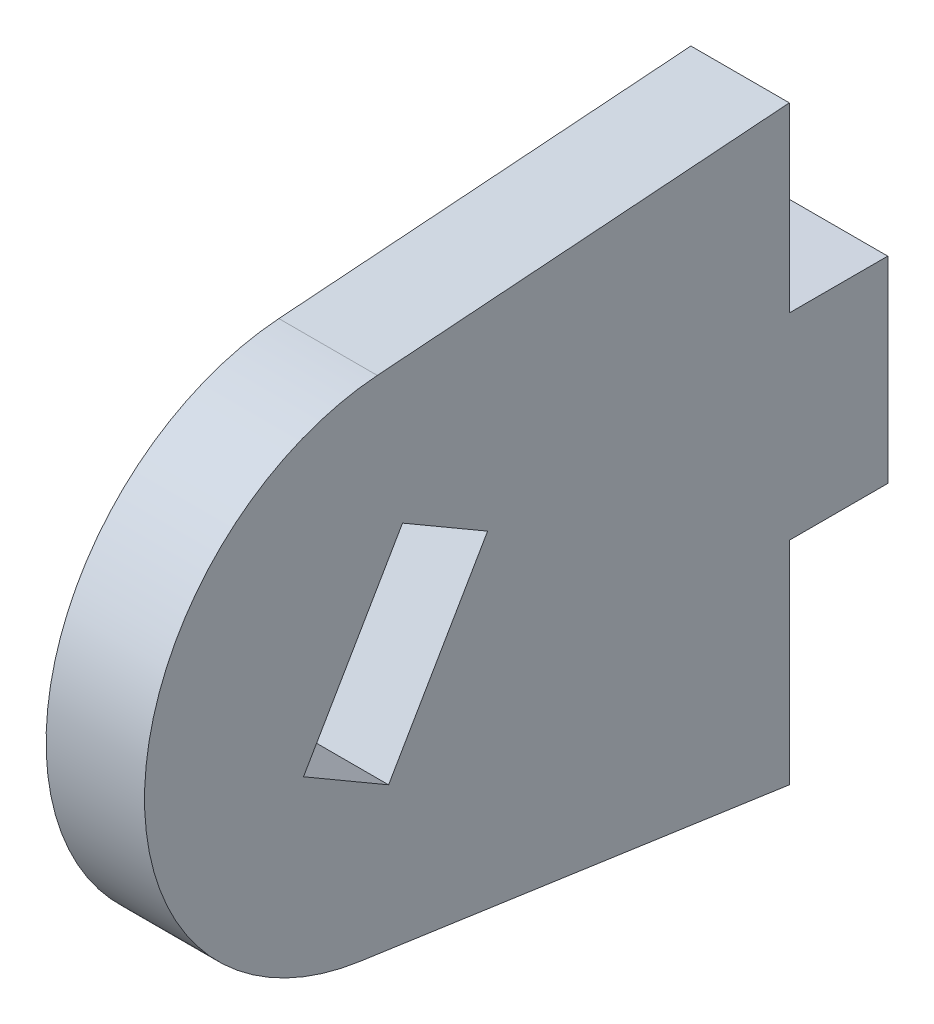
ISO-10303-21;
HEADER;
FILE_DESCRIPTION(('STEP AP214'),'2;1');
FILE_NAME('part.step','',(''),(''),'','','');
FILE_SCHEMA(('AUTOMOTIVE_DESIGN { 1 0 10303 214 1 1 1 1 }'));
ENDSEC;
DATA;
#1=APPLICATION_CONTEXT('core data for automotive mechanical design processes');
#2=APPLICATION_PROTOCOL_DEFINITION('international standard','automotive_design',2000,#1);
#3=PRODUCT_CONTEXT('',#1,'mechanical');
#4=PRODUCT('Part','Part','',(#3));
#5=PRODUCT_RELATED_PRODUCT_CATEGORY('part','',(#4));
#6=PRODUCT_DEFINITION_FORMATION('','',#4);
#7=PRODUCT_DEFINITION_CONTEXT('part definition',#1,'design');
#8=PRODUCT_DEFINITION('design','',#6,#7);
#9=PRODUCT_DEFINITION_SHAPE('','',#8);
#10=(LENGTH_UNIT() NAMED_UNIT(*) SI_UNIT(.MILLI.,.METRE.));
#11=(NAMED_UNIT(*) PLANE_ANGLE_UNIT() SI_UNIT($,.RADIAN.));
#12=(NAMED_UNIT(*) SI_UNIT($,.STERADIAN.) SOLID_ANGLE_UNIT());
#13=UNCERTAINTY_MEASURE_WITH_UNIT(LENGTH_MEASURE(1.E-05),#10,'distance_accuracy_value','');
#14=(GEOMETRIC_REPRESENTATION_CONTEXT(3) GLOBAL_UNCERTAINTY_ASSIGNED_CONTEXT((#13)) GLOBAL_UNIT_ASSIGNED_CONTEXT((#10,
#11,#12)) REPRESENTATION_CONTEXT('',''));
#15=CARTESIAN_POINT('',(0.,0.,0.));
#16=DIRECTION('',(0.,0.,1.));
#17=DIRECTION('',(1.,0.,0.));
#18=AXIS2_PLACEMENT_3D('',#15,#16,#17);
#19=CARTESIAN_POINT('',(2.5,0.,20.));
#20=DIRECTION('',(1.,0.,0.));
#21=DIRECTION('',(0.,0.,-1.));
#22=AXIS2_PLACEMENT_3D('',#19,#20,#21);
#23=PLANE('',#22);
#24=DIRECTION('',(0.,1.,0.));
#25=VECTOR('',#24,1.);
#26=CARTESIAN_POINT('',(2.5,5.,0.));
#27=LINE('',#26,#25);
#28=CARTESIAN_POINT('',(2.5,5.,0.));
#29=VERTEX_POINT('',#28);
#30=CARTESIAN_POINT('',(2.5,14.2422824883128,0.));
#31=VERTEX_POINT('',#30);
#32=EDGE_CURVE('E164',#29,#31,#27,.T.);
#33=ORIENTED_EDGE('',*,*,#32,.T.);
#34=DIRECTION('',(0.,-0.0727282972971378,0.997351790880359));
#35=VECTOR('',#34,1.);
#36=CARTESIAN_POINT('',(2.5,14.2422824883128,0.));
#37=LINE('',#36,#35);
#38=CARTESIAN_POINT('',(2.5,12.7162353337246,20.9272857905385));
#39=VERTEX_POINT('',#38);
#40=EDGE_CURVE('E167',#31,#39,#37,.T.);
#41=ORIENTED_EDGE('',*,*,#40,.T.);
#42=CARTESIAN_POINT('',(2.5,0.,20.));
#43=DIRECTION('',(1.,0.,0.));
#44=DIRECTION('',(0.,0.,-1.));
#45=AXIS2_PLACEMENT_3D('',#42,#43,#44);
#46=CIRCLE('',#45,12.75);
#47=CARTESIAN_POINT('',(2.5,-12.6201385773802,21.8151039330352));
#48=VERTEX_POINT('',#47);
#49=EDGE_CURVE('E170',#39,#48,#46,.T.);
#50=ORIENTED_EDGE('',*,*,#49,.T.);
#51=DIRECTION('',(0.,-0.142361092787071,-0.989814790382762));
#52=VECTOR('',#51,1.);
#53=CARTESIAN_POINT('',(2.5,-15.7577175116872,0.));
#54=LINE('',#53,#52);
#55=CARTESIAN_POINT('',(2.5,-15.7577175116872,0.));
#56=VERTEX_POINT('',#55);
#57=EDGE_CURVE('E172',#48,#56,#54,.T.);
#58=ORIENTED_EDGE('',*,*,#57,.T.);
#59=DIRECTION('',(0.,1.,0.));
#60=VECTOR('',#59,1.);
#61=CARTESIAN_POINT('',(2.5,-15.7577175116872,0.));
#62=LINE('',#61,#60);
#63=CARTESIAN_POINT('',(2.5,-5.,0.));
#64=VERTEX_POINT('',#63);
#65=EDGE_CURVE('E174',#56,#64,#62,.T.);
#66=ORIENTED_EDGE('',*,*,#65,.T.);
#67=DIRECTION('',(0.,0.,-1.));
#68=VECTOR('',#67,1.);
#69=CARTESIAN_POINT('',(2.5,-5.,-5.));
#70=LINE('',#69,#68);
#71=CARTESIAN_POINT('',(2.5,-5.,-5.));
#72=VERTEX_POINT('',#71);
#73=EDGE_CURVE('E176',#64,#72,#70,.T.);
#74=ORIENTED_EDGE('',*,*,#73,.T.);
#75=DIRECTION('',(0.,1.,0.));
#76=VECTOR('',#75,1.);
#77=CARTESIAN_POINT('',(2.5,5.,-5.));
#78=LINE('',#77,#76);
#79=CARTESIAN_POINT('',(2.5,5.,-5.));
#80=VERTEX_POINT('',#79);
#81=EDGE_CURVE('E178',#72,#80,#78,.T.);
#82=ORIENTED_EDGE('',*,*,#81,.T.);
#83=DIRECTION('',(0.,0.,1.));
#84=VECTOR('',#83,1.);
#85=CARTESIAN_POINT('',(2.5,5.,-5.));
#86=LINE('',#85,#84);
#87=EDGE_CURVE('E180',#80,#29,#86,.T.);
#88=ORIENTED_EDGE('',*,*,#87,.T.);
#89=EDGE_LOOP('',(#33,#41,#50,#58,#66,#74,#82,#88));
#90=FACE_BOUND('',#89,.T.);
#91=DIRECTION('',(0.,0.864310534046553,-0.502958547731483));
#92=VECTOR('',#91,1.);
#93=CARTESIAN_POINT('',(2.5,-5.57894903956147,20.3540164035411));
#94=LINE('',#93,#92);
#95=CARTESIAN_POINT('',(2.5,-5.57894903956147,20.3540164035411));
#96=VERTEX_POINT('',#95);
#97=CARTESIAN_POINT('',(2.5,3.06415630090407,15.3244309262262));
#98=VERTEX_POINT('',#97);
#99=EDGE_CURVE('E136',#96,#98,#94,.T.);
#100=ORIENTED_EDGE('',*,*,#99,.F.);
#101=DIRECTION('',(0.,-0.502958547731484,-0.864310534046552));
#102=VECTOR('',#101,1.);
#103=CARTESIAN_POINT('',(2.5,-3.06415630090405,24.6755690737738));
#104=LINE('',#103,#102);
#105=CARTESIAN_POINT('',(2.5,-3.06415630090405,24.6755690737738));
#106=VERTEX_POINT('',#105);
#107=EDGE_CURVE('E128',#106,#96,#104,.T.);
#108=ORIENTED_EDGE('',*,*,#107,.F.);
#109=DIRECTION('',(0.,-0.864310534046553,0.502958547731483));
#110=VECTOR('',#109,1.);
#111=CARTESIAN_POINT('',(2.5,5.57894903956148,19.645983596459));
#112=LINE('',#111,#110);
#113=CARTESIAN_POINT('',(2.5,5.57894903956148,19.645983596459));
#114=VERTEX_POINT('',#113);
#115=EDGE_CURVE('E150',#114,#106,#112,.T.);
#116=ORIENTED_EDGE('',*,*,#115,.F.);
#117=DIRECTION('',(0.,0.502958547731482,0.864310534046553));
#118=VECTOR('',#117,1.);
#119=CARTESIAN_POINT('',(2.5,3.06415630090407,15.3244309262262));
#120=LINE('',#119,#118);
#121=EDGE_CURVE('E148',#98,#114,#120,.T.);
#122=ORIENTED_EDGE('',*,*,#121,.F.);
#123=EDGE_LOOP('',(#100,#108,#116,#122));
#124=FACE_BOUND('',#123,.T.);
#125=ADVANCED_FACE('F39',(#90,#124),#23,.T.);
#126=CARTESIAN_POINT('',(-2.5,0.,20.));
#127=DIRECTION('',(1.,0.,0.));
#128=DIRECTION('',(0.,0.,-1.));
#129=AXIS2_PLACEMENT_3D('',#126,#127,#128);
#130=PLANE('',#129);
#131=DIRECTION('',(0.,1.,0.));
#132=VECTOR('',#131,1.);
#133=CARTESIAN_POINT('',(-2.5,5.,0.));
#134=LINE('',#133,#132);
#135=CARTESIAN_POINT('',(-2.5,5.,0.));
#136=VERTEX_POINT('',#135);
#137=CARTESIAN_POINT('',(-2.5,14.2422824883128,0.));
#138=VERTEX_POINT('',#137);
#139=EDGE_CURVE('E144',#136,#138,#134,.T.);
#140=ORIENTED_EDGE('',*,*,#139,.F.);
#141=DIRECTION('',(0.,0.,1.));
#142=VECTOR('',#141,1.);
#143=CARTESIAN_POINT('',(-2.5,5.,-5.));
#144=LINE('',#143,#142);
#145=CARTESIAN_POINT('',(-2.5,5.,-5.));
#146=VERTEX_POINT('',#145);
#147=EDGE_CURVE('E168',#146,#136,#144,.T.);
#148=ORIENTED_EDGE('',*,*,#147,.F.);
#149=DIRECTION('',(0.,1.,0.));
#150=VECTOR('',#149,1.);
#151=CARTESIAN_POINT('',(-2.5,5.,-5.));
#152=LINE('',#151,#150);
#153=CARTESIAN_POINT('',(-2.5,-5.,-5.));
#154=VERTEX_POINT('',#153);
#155=EDGE_CURVE('E195',#154,#146,#152,.T.);
#156=ORIENTED_EDGE('',*,*,#155,.F.);
#157=DIRECTION('',(0.,0.,-1.));
#158=VECTOR('',#157,1.);
#159=CARTESIAN_POINT('',(-2.5,-5.,-5.));
#160=LINE('',#159,#158);
#161=CARTESIAN_POINT('',(-2.5,-5.,0.));
#162=VERTEX_POINT('',#161);
#163=EDGE_CURVE('E193',#162,#154,#160,.T.);
#164=ORIENTED_EDGE('',*,*,#163,.F.);
#165=DIRECTION('',(0.,1.,0.));
#166=VECTOR('',#165,1.);
#167=CARTESIAN_POINT('',(-2.5,-15.7577175116872,0.));
#168=LINE('',#167,#166);
#169=CARTESIAN_POINT('',(-2.5,-15.7577175116872,0.));
#170=VERTEX_POINT('',#169);
#171=EDGE_CURVE('E191',#170,#162,#168,.T.);
#172=ORIENTED_EDGE('',*,*,#171,.F.);
#173=DIRECTION('',(0.,-0.142361092787071,-0.989814790382762));
#174=VECTOR('',#173,1.);
#175=CARTESIAN_POINT('',(-2.5,-15.7577175116872,0.));
#176=LINE('',#175,#174);
#177=CARTESIAN_POINT('',(-2.5,-12.6201385773802,21.8151039330352));
#178=VERTEX_POINT('',#177);
#179=EDGE_CURVE('E189',#178,#170,#176,.T.);
#180=ORIENTED_EDGE('',*,*,#179,.F.);
#181=CARTESIAN_POINT('',(-2.5,0.,20.));
#182=DIRECTION('',(1.,0.,0.));
#183=DIRECTION('',(0.,0.,-1.));
#184=AXIS2_PLACEMENT_3D('',#181,#182,#183);
#185=CIRCLE('',#184,12.75);
#186=CARTESIAN_POINT('',(-2.5,12.7162353337246,20.9272857905385));
#187=VERTEX_POINT('',#186);
#188=EDGE_CURVE('E187',#187,#178,#185,.T.);
#189=ORIENTED_EDGE('',*,*,#188,.F.);
#190=DIRECTION('',(0.,-0.0727282972971378,0.997351790880359));
#191=VECTOR('',#190,1.);
#192=CARTESIAN_POINT('',(-2.5,14.2422824883128,0.));
#193=LINE('',#192,#191);
#194=EDGE_CURVE('E185',#138,#187,#193,.T.);
#195=ORIENTED_EDGE('',*,*,#194,.F.);
#196=EDGE_LOOP('',(#140,#148,#156,#164,#172,#180,#189,#195));
#197=FACE_BOUND('',#196,.T.);
#198=DIRECTION('',(0.,-0.502958547731484,-0.864310534046552));
#199=VECTOR('',#198,1.);
#200=CARTESIAN_POINT('',(-2.5,-3.06415630090405,24.6755690737738));
#201=LINE('',#200,#199);
#202=CARTESIAN_POINT('',(-2.5,-3.06415630090405,24.6755690737738));
#203=VERTEX_POINT('',#202);
#204=CARTESIAN_POINT('',(-2.5,-5.57894903956147,20.3540164035411));
#205=VERTEX_POINT('',#204);
#206=EDGE_CURVE('E62',#203,#205,#201,.T.);
#207=ORIENTED_EDGE('',*,*,#206,.T.);
#208=DIRECTION('',(0.,0.864310534046553,-0.502958547731483));
#209=VECTOR('',#208,1.);
#210=CARTESIAN_POINT('',(-2.5,-5.57894903956147,20.3540164035411));
#211=LINE('',#210,#209);
#212=CARTESIAN_POINT('',(-2.5,3.06415630090407,15.3244309262262));
#213=VERTEX_POINT('',#212);
#214=EDGE_CURVE('E143',#205,#213,#211,.T.);
#215=ORIENTED_EDGE('',*,*,#214,.T.);
#216=DIRECTION('',(0.,0.502958547731482,0.864310534046553));
#217=VECTOR('',#216,1.);
#218=CARTESIAN_POINT('',(-2.5,3.06415630090407,15.3244309262262));
#219=LINE('',#218,#217);
#220=CARTESIAN_POINT('',(-2.5,5.57894903956148,19.645983596459));
#221=VERTEX_POINT('',#220);
#222=EDGE_CURVE('E156',#213,#221,#219,.T.);
#223=ORIENTED_EDGE('',*,*,#222,.T.);
#224=DIRECTION('',(0.,-0.864310534046553,0.502958547731483));
#225=VECTOR('',#224,1.);
#226=CARTESIAN_POINT('',(-2.5,5.57894903956148,19.645983596459));
#227=LINE('',#226,#225);
#228=EDGE_CURVE('E137',#221,#203,#227,.T.);
#229=ORIENTED_EDGE('',*,*,#228,.T.);
#230=EDGE_LOOP('',(#207,#215,#223,#229));
#231=FACE_BOUND('',#230,.T.);
#232=ADVANCED_FACE('F225',(#197,#231),#130,.F.);
#233=CARTESIAN_POINT('',(2.5,5.,0.));
#234=DIRECTION('',(0.,0.,1.));
#235=DIRECTION('',(1.,0.,0.));
#236=AXIS2_PLACEMENT_3D('',#233,#234,#235);
#237=PLANE('',#236);
#238=ORIENTED_EDGE('',*,*,#139,.T.);
#239=DIRECTION('',(-1.,0.,0.));
#240=VECTOR('',#239,1.);
#241=CARTESIAN_POINT('',(2.5,14.2422824883128,0.));
#242=LINE('',#241,#240);
#243=EDGE_CURVE('E11',#31,#138,#242,.T.);
#244=ORIENTED_EDGE('',*,*,#243,.F.);
#245=ORIENTED_EDGE('',*,*,#32,.F.);
#246=DIRECTION('',(-1.,0.,0.));
#247=VECTOR('',#246,1.);
#248=CARTESIAN_POINT('',(2.5,5.,0.));
#249=LINE('',#248,#247);
#250=EDGE_CURVE('E182',#29,#136,#249,.T.);
#251=ORIENTED_EDGE('',*,*,#250,.T.);
#252=EDGE_LOOP('',(#238,#244,#245,#251));
#253=FACE_BOUND('',#252,.T.);
#254=ADVANCED_FACE('F41',(#253),#237,.F.);
#255=CARTESIAN_POINT('',(2.5,14.2422824883128,0.));
#256=DIRECTION('',(0.,-0.997351790880359,-0.0727282972971378));
#257=DIRECTION('',(0.,0.0727282972971378,-0.997351790880359));
#258=AXIS2_PLACEMENT_3D('',#255,#256,#257);
#259=PLANE('',#258);
#260=ORIENTED_EDGE('',*,*,#194,.T.);
#261=DIRECTION('',(-1.,0.,0.));
#262=VECTOR('',#261,1.);
#263=CARTESIAN_POINT('',(2.5,12.7162353337246,20.9272857905385));
#264=LINE('',#263,#262);
#265=EDGE_CURVE('E47',#39,#187,#264,.T.);
#266=ORIENTED_EDGE('',*,*,#265,.F.);
#267=ORIENTED_EDGE('',*,*,#40,.F.);
#268=ORIENTED_EDGE('',*,*,#243,.T.);
#269=EDGE_LOOP('',(#260,#266,#267,#268));
#270=FACE_BOUND('',#269,.T.);
#271=ADVANCED_FACE('F242',(#270),#259,.F.);
#272=CARTESIAN_POINT('',(2.5,0.,20.));
#273=DIRECTION('',(-1.,0.,0.));
#274=DIRECTION('',(0.,0.,1.));
#275=AXIS2_PLACEMENT_3D('',#272,#273,#274);
#276=CYLINDRICAL_SURFACE('',#275,12.75);
#277=ORIENTED_EDGE('',*,*,#188,.T.);
#278=DIRECTION('',(-1.,0.,0.));
#279=VECTOR('',#278,1.);
#280=CARTESIAN_POINT('',(2.5,-12.6201385773802,21.8151039330352));
#281=LINE('',#280,#279);
#282=EDGE_CURVE('E212',#48,#178,#281,.T.);
#283=ORIENTED_EDGE('',*,*,#282,.F.);
#284=ORIENTED_EDGE('',*,*,#49,.F.);
#285=ORIENTED_EDGE('',*,*,#265,.T.);
#286=EDGE_LOOP('',(#277,#283,#284,#285));
#287=FACE_BOUND('',#286,.T.);
#288=ADVANCED_FACE('F219',(#287),#276,.T.);
#289=CARTESIAN_POINT('',(2.5,-15.7577175116872,0.));
#290=DIRECTION('',(0.,0.989814790382762,-0.142361092787071));
#291=DIRECTION('',(0.,0.142361092787071,0.989814790382762));
#292=AXIS2_PLACEMENT_3D('',#289,#290,#291);
#293=PLANE('',#292);
#294=ORIENTED_EDGE('',*,*,#179,.T.);
#295=DIRECTION('',(-1.,0.,0.));
#296=VECTOR('',#295,1.);
#297=CARTESIAN_POINT('',(2.5,-15.7577175116872,0.));
#298=LINE('',#297,#296);
#299=EDGE_CURVE('E209',#56,#170,#298,.T.);
#300=ORIENTED_EDGE('',*,*,#299,.F.);
#301=ORIENTED_EDGE('',*,*,#57,.F.);
#302=ORIENTED_EDGE('',*,*,#282,.T.);
#303=EDGE_LOOP('',(#294,#300,#301,#302));
#304=FACE_BOUND('',#303,.T.);
#305=ADVANCED_FACE('F231',(#304),#293,.F.);
#306=CARTESIAN_POINT('',(2.5,-15.7577175116872,0.));
#307=DIRECTION('',(0.,0.,1.));
#308=DIRECTION('',(1.,0.,0.));
#309=AXIS2_PLACEMENT_3D('',#306,#307,#308);
#310=PLANE('',#309);
#311=ORIENTED_EDGE('',*,*,#171,.T.);
#312=DIRECTION('',(-1.,0.,0.));
#313=VECTOR('',#312,1.);
#314=CARTESIAN_POINT('',(2.5,-5.,0.));
#315=LINE('',#314,#313);
#316=EDGE_CURVE('E206',#64,#162,#315,.T.);
#317=ORIENTED_EDGE('',*,*,#316,.F.);
#318=ORIENTED_EDGE('',*,*,#65,.F.);
#319=ORIENTED_EDGE('',*,*,#299,.T.);
#320=EDGE_LOOP('',(#311,#317,#318,#319));
#321=FACE_BOUND('',#320,.T.);
#322=ADVANCED_FACE('F235',(#321),#310,.F.);
#323=CARTESIAN_POINT('',(2.5,-5.,-5.));
#324=DIRECTION('',(0.,1.,0.));
#325=DIRECTION('',(0.,0.,1.));
#326=AXIS2_PLACEMENT_3D('',#323,#324,#325);
#327=PLANE('',#326);
#328=ORIENTED_EDGE('',*,*,#163,.T.);
#329=DIRECTION('',(-1.,0.,0.));
#330=VECTOR('',#329,1.);
#331=CARTESIAN_POINT('',(2.5,-5.,-5.));
#332=LINE('',#331,#330);
#333=EDGE_CURVE('E203',#72,#154,#332,.T.);
#334=ORIENTED_EDGE('',*,*,#333,.F.);
#335=ORIENTED_EDGE('',*,*,#73,.F.);
#336=ORIENTED_EDGE('',*,*,#316,.T.);
#337=EDGE_LOOP('',(#328,#334,#335,#336));
#338=FACE_BOUND('',#337,.T.);
#339=ADVANCED_FACE('F255',(#338),#327,.F.);
#340=CARTESIAN_POINT('',(2.5,5.,-5.));
#341=DIRECTION('',(0.,0.,1.));
#342=DIRECTION('',(0.,-1.,0.));
#343=AXIS2_PLACEMENT_3D('',#340,#341,#342);
#344=PLANE('',#343);
#345=ORIENTED_EDGE('',*,*,#155,.T.);
#346=DIRECTION('',(-1.,0.,0.));
#347=VECTOR('',#346,1.);
#348=CARTESIAN_POINT('',(2.5,5.,-5.));
#349=LINE('',#348,#347);
#350=EDGE_CURVE('E200',#80,#146,#349,.T.);
#351=ORIENTED_EDGE('',*,*,#350,.F.);
#352=ORIENTED_EDGE('',*,*,#81,.F.);
#353=ORIENTED_EDGE('',*,*,#333,.T.);
#354=EDGE_LOOP('',(#345,#351,#352,#353));
#355=FACE_BOUND('',#354,.T.);
#356=ADVANCED_FACE('F253',(#355),#344,.F.);
#357=CARTESIAN_POINT('',(2.5,5.,-5.));
#358=DIRECTION('',(0.,-1.,0.));
#359=DIRECTION('',(0.,0.,-1.));
#360=AXIS2_PLACEMENT_3D('',#357,#358,#359);
#361=PLANE('',#360);
#362=ORIENTED_EDGE('',*,*,#147,.T.);
#363=ORIENTED_EDGE('',*,*,#250,.F.);
#364=ORIENTED_EDGE('',*,*,#87,.F.);
#365=ORIENTED_EDGE('',*,*,#350,.T.);
#366=EDGE_LOOP('',(#362,#363,#364,#365));
#367=FACE_BOUND('',#366,.T.);
#368=ADVANCED_FACE('F248',(#367),#361,.F.);
#369=CARTESIAN_POINT('',(2.5,-3.06415630090405,24.6755690737738));
#370=DIRECTION('',(0.,0.864310534046552,-0.502958547731484));
#371=DIRECTION('',(0.,0.502958547731484,0.864310534046552));
#372=AXIS2_PLACEMENT_3D('',#369,#370,#371);
#373=PLANE('',#372);
#374=ORIENTED_EDGE('',*,*,#206,.F.);
#375=DIRECTION('',(-1.,0.,0.));
#376=VECTOR('',#375,1.);
#377=CARTESIAN_POINT('',(2.5,-3.06415630090405,24.6755690737738));
#378=LINE('',#377,#376);
#379=EDGE_CURVE('E132',#106,#203,#378,.T.);
#380=ORIENTED_EDGE('',*,*,#379,.F.);
#381=ORIENTED_EDGE('',*,*,#107,.T.);
#382=DIRECTION('',(-1.,0.,0.));
#383=VECTOR('',#382,1.);
#384=CARTESIAN_POINT('',(2.5,-5.57894903956147,20.3540164035411));
#385=LINE('',#384,#383);
#386=EDGE_CURVE('E131',#96,#205,#385,.T.);
#387=ORIENTED_EDGE('',*,*,#386,.T.);
#388=EDGE_LOOP('',(#374,#380,#381,#387));
#389=FACE_BOUND('',#388,.T.);
#390=ADVANCED_FACE('F130',(#389),#373,.T.);
#391=CARTESIAN_POINT('',(2.5,-5.57894903956147,20.3540164035411));
#392=DIRECTION('',(0.,0.502958547731483,0.864310534046553));
#393=DIRECTION('',(0.,-0.864310534046553,0.502958547731483));
#394=AXIS2_PLACEMENT_3D('',#391,#392,#393);
#395=PLANE('',#394);
#396=ORIENTED_EDGE('',*,*,#214,.F.);
#397=ORIENTED_EDGE('',*,*,#386,.F.);
#398=ORIENTED_EDGE('',*,*,#99,.T.);
#399=DIRECTION('',(-1.,0.,0.));
#400=VECTOR('',#399,1.);
#401=CARTESIAN_POINT('',(2.5,3.06415630090407,15.3244309262262));
#402=LINE('',#401,#400);
#403=EDGE_CURVE('E145',#98,#213,#402,.T.);
#404=ORIENTED_EDGE('',*,*,#403,.T.);
#405=EDGE_LOOP('',(#396,#397,#398,#404));
#406=FACE_BOUND('',#405,.T.);
#407=ADVANCED_FACE('F140',(#406),#395,.T.);
#408=CARTESIAN_POINT('',(2.5,3.06415630090407,15.3244309262262));
#409=DIRECTION('',(0.,-0.864310534046553,0.502958547731482));
#410=DIRECTION('',(0.,-0.502958547731482,-0.864310534046553));
#411=AXIS2_PLACEMENT_3D('',#408,#409,#410);
#412=PLANE('',#411);
#413=ORIENTED_EDGE('',*,*,#222,.F.);
#414=ORIENTED_EDGE('',*,*,#403,.F.);
#415=ORIENTED_EDGE('',*,*,#121,.T.);
#416=DIRECTION('',(-1.,0.,0.));
#417=VECTOR('',#416,1.);
#418=CARTESIAN_POINT('',(2.5,5.57894903956148,19.645983596459));
#419=LINE('',#418,#417);
#420=EDGE_CURVE('E54',#114,#221,#419,.T.);
#421=ORIENTED_EDGE('',*,*,#420,.T.);
#422=EDGE_LOOP('',(#413,#414,#415,#421));
#423=FACE_BOUND('',#422,.T.);
#424=ADVANCED_FACE('F280',(#423),#412,.T.);
#425=CARTESIAN_POINT('',(2.5,5.57894903956148,19.645983596459));
#426=DIRECTION('',(0.,-0.502958547731483,-0.864310534046553));
#427=DIRECTION('',(0.,0.864310534046553,-0.502958547731483));
#428=AXIS2_PLACEMENT_3D('',#425,#426,#427);
#429=PLANE('',#428);
#430=ORIENTED_EDGE('',*,*,#228,.F.);
#431=ORIENTED_EDGE('',*,*,#420,.F.);
#432=ORIENTED_EDGE('',*,*,#115,.T.);
#433=ORIENTED_EDGE('',*,*,#379,.T.);
#434=EDGE_LOOP('',(#430,#431,#432,#433));
#435=FACE_BOUND('',#434,.T.);
#436=ADVANCED_FACE('F284',(#435),#429,.T.);
#437=CLOSED_SHELL('',(#125,#232,#254,#271,#288,#305,#322,#339,#356,#368,#390,#407,#424,#436));
#438=MANIFOLD_SOLID_BREP('B2',#437);
#439=ADVANCED_BREP_SHAPE_REPRESENTATION('',(#18,#438),#14);
#440=SHAPE_DEFINITION_REPRESENTATION(#9,#439);
ENDSEC;
END-ISO-10303-21;
